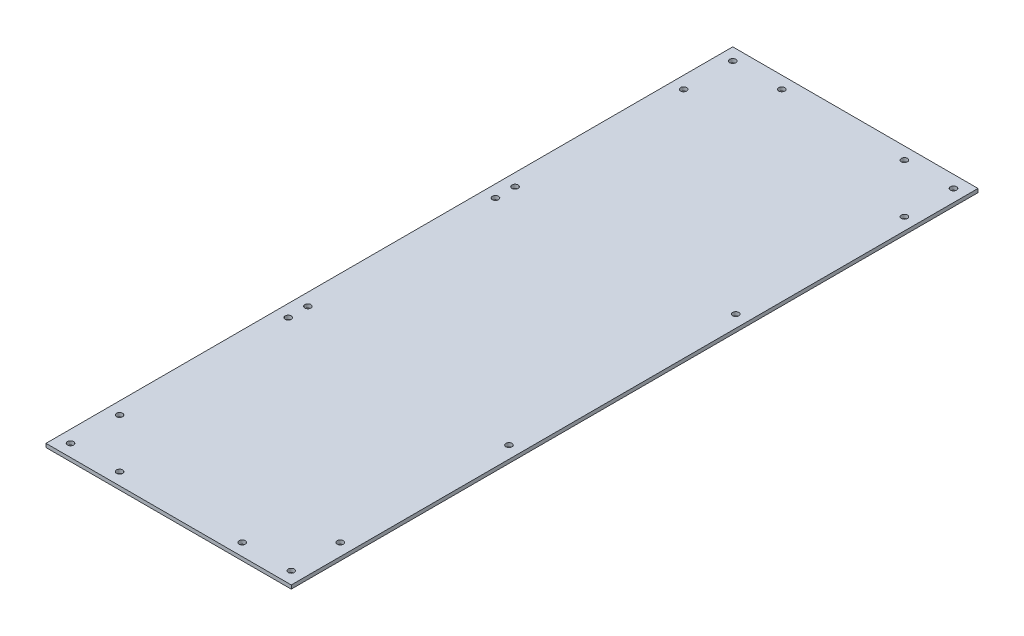
ISO-10303-21;
HEADER;
FILE_DESCRIPTION(('STEP AP214'),'2;1');
FILE_NAME('part.step','',(''),(''),'','','');
FILE_SCHEMA(('AUTOMOTIVE_DESIGN { 1 0 10303 214 1 1 1 1 }'));
ENDSEC;
DATA;
#1=APPLICATION_CONTEXT('core data for automotive mechanical design processes');
#2=APPLICATION_PROTOCOL_DEFINITION('international standard','automotive_design',2000,#1);
#3=PRODUCT_CONTEXT('',#1,'mechanical');
#4=PRODUCT('Part','Part','',(#3));
#5=PRODUCT_RELATED_PRODUCT_CATEGORY('part','',(#4));
#6=PRODUCT_DEFINITION_FORMATION('','',#4);
#7=PRODUCT_DEFINITION_CONTEXT('part definition',#1,'design');
#8=PRODUCT_DEFINITION('design','',#6,#7);
#9=PRODUCT_DEFINITION_SHAPE('','',#8);
#10=(LENGTH_UNIT() NAMED_UNIT(*) SI_UNIT(.MILLI.,.METRE.));
#11=(NAMED_UNIT(*) PLANE_ANGLE_UNIT() SI_UNIT($,.RADIAN.));
#12=(NAMED_UNIT(*) SI_UNIT($,.STERADIAN.) SOLID_ANGLE_UNIT());
#13=UNCERTAINTY_MEASURE_WITH_UNIT(LENGTH_MEASURE(1.E-05),#10,'distance_accuracy_value','');
#14=(GEOMETRIC_REPRESENTATION_CONTEXT(3) GLOBAL_UNCERTAINTY_ASSIGNED_CONTEXT((#13)) GLOBAL_UNIT_ASSIGNED_CONTEXT((#10,
#11,#12)) REPRESENTATION_CONTEXT('',''));
#15=CARTESIAN_POINT('',(0.,0.,0.));
#16=DIRECTION('',(0.,0.,1.));
#17=DIRECTION('',(1.,0.,0.));
#18=AXIS2_PLACEMENT_3D('',#15,#16,#17);
#19=CARTESIAN_POINT('',(0.,-3.,0.));
#20=DIRECTION('',(0.,-1.,0.));
#21=DIRECTION('',(1.,0.,0.));
#22=AXIS2_PLACEMENT_3D('',#19,#20,#21);
#23=PLANE('',#22);
#24=CARTESIAN_POINT('',(115.641025641026,-3.,-465.897435897436));
#25=DIRECTION('',(0.,1.,0.));
#26=DIRECTION('',(0.,0.,-1.));
#27=AXIS2_PLACEMENT_3D('',#24,#25,#26);
#28=CIRCLE('',#27,2.5);
#29=CARTESIAN_POINT('',(115.641025641026,-3.,-468.397435897436));
#30=VERTEX_POINT('',#29);
#31=EDGE_CURVE('E11',#30,#30,#28,.T.);
#32=ORIENTED_EDGE('',*,*,#31,.T.);
#33=EDGE_LOOP('',(#32));
#34=FACE_BOUND('',#33,.T.);
#35=CARTESIAN_POINT('',(-24.3589743589745,-3.,34.102564102564));
#36=DIRECTION('',(0.,1.,0.));
#37=DIRECTION('',(0.,0.,-1.));
#38=AXIS2_PLACEMENT_3D('',#35,#36,#37);
#39=CIRCLE('',#38,2.5);
#40=CARTESIAN_POINT('',(-24.3589743589745,-3.,31.602564102564));
#41=VERTEX_POINT('',#40);
#42=EDGE_CURVE('E24',#41,#41,#39,.T.);
#43=ORIENTED_EDGE('',*,*,#42,.T.);
#44=EDGE_LOOP('',(#43));
#45=FACE_BOUND('',#44,.T.);
#46=CARTESIAN_POINT('',(115.641025641026,-3.,74.102564102564));
#47=DIRECTION('',(0.,-1.,0.));
#48=DIRECTION('',(0.,0.,-1.));
#49=AXIS2_PLACEMENT_3D('',#46,#47,#48);
#50=CIRCLE('',#49,2.5);
#51=CARTESIAN_POINT('',(115.641025641026,-3.,71.602564102564));
#52=VERTEX_POINT('',#51);
#53=EDGE_CURVE('E188',#52,#52,#50,.T.);
#54=ORIENTED_EDGE('',*,*,#53,.F.);
#55=EDGE_LOOP('',(#54));
#56=FACE_BOUND('',#55,.T.);
#57=CARTESIAN_POINT('',(155.641025641026,-3.,34.102564102564));
#58=DIRECTION('',(0.,-1.,0.));
#59=DIRECTION('',(0.,0.,-1.));
#60=AXIS2_PLACEMENT_3D('',#57,#58,#59);
#61=CIRCLE('',#60,2.5);
#62=CARTESIAN_POINT('',(155.641025641026,-3.,31.602564102564));
#63=VERTEX_POINT('',#62);
#64=EDGE_CURVE('E185',#63,#63,#61,.T.);
#65=ORIENTED_EDGE('',*,*,#64,.F.);
#66=EDGE_LOOP('',(#65));
#67=FACE_BOUND('',#66,.T.);
#68=CARTESIAN_POINT('',(15.6410256410257,-3.,-465.897435897436));
#69=DIRECTION('',(0.,-1.,0.));
#70=DIRECTION('',(0.,0.,-1.));
#71=AXIS2_PLACEMENT_3D('',#68,#69,#70);
#72=CIRCLE('',#71,2.5);
#73=CARTESIAN_POINT('',(15.6410256410257,-3.,-468.397435897436));
#74=VERTEX_POINT('',#73);
#75=EDGE_CURVE('E182',#74,#74,#72,.T.);
#76=ORIENTED_EDGE('',*,*,#75,.F.);
#77=EDGE_LOOP('',(#76));
#78=FACE_BOUND('',#77,.T.);
#79=CARTESIAN_POINT('',(155.641025641026,-3.,-288.397435897436));
#80=DIRECTION('',(0.,-1.,0.));
#81=DIRECTION('',(1.,0.,0.));
#82=AXIS2_PLACEMENT_3D('',#79,#80,#81);
#83=CIRCLE('',#82,2.5);
#84=CARTESIAN_POINT('',(158.141025641026,-3.,-288.397435897436));
#85=VERTEX_POINT('',#84);
#86=EDGE_CURVE('E179',#85,#85,#83,.T.);
#87=ORIENTED_EDGE('',*,*,#86,.F.);
#88=EDGE_LOOP('',(#87));
#89=FACE_BOUND('',#88,.T.);
#90=CARTESIAN_POINT('',(-24.3589743589744,-3.,-119.397435897436));
#91=DIRECTION('',(0.,-1.,0.));
#92=DIRECTION('',(1.,0.,0.));
#93=AXIS2_PLACEMENT_3D('',#90,#91,#92);
#94=CIRCLE('',#93,2.5);
#95=CARTESIAN_POINT('',(-21.8589743589744,-3.,-119.397435897436));
#96=VERTEX_POINT('',#95);
#97=EDGE_CURVE('E176',#96,#96,#94,.T.);
#98=ORIENTED_EDGE('',*,*,#97,.F.);
#99=EDGE_LOOP('',(#98));
#100=FACE_BOUND('',#99,.T.);
#101=CARTESIAN_POINT('',(155.641025641026,-3.,-103.397435897436));
#102=DIRECTION('',(0.,-1.,0.));
#103=DIRECTION('',(1.,0.,0.));
#104=AXIS2_PLACEMENT_3D('',#101,#102,#103);
#105=CIRCLE('',#104,2.5);
#106=CARTESIAN_POINT('',(158.141025641026,-3.,-103.397435897436));
#107=VERTEX_POINT('',#106);
#108=EDGE_CURVE('E173',#107,#107,#105,.T.);
#109=ORIENTED_EDGE('',*,*,#108,.F.);
#110=EDGE_LOOP('',(#109));
#111=FACE_BOUND('',#110,.T.);
#112=CARTESIAN_POINT('',(-24.3589743589744,-3.,-103.397435897436));
#113=DIRECTION('',(0.,-1.,0.));
#114=DIRECTION('',(1.,0.,0.));
#115=AXIS2_PLACEMENT_3D('',#112,#113,#114);
#116=CIRCLE('',#115,2.5);
#117=CARTESIAN_POINT('',(-21.8589743589744,-3.,-103.397435897436));
#118=VERTEX_POINT('',#117);
#119=EDGE_CURVE('E170',#118,#118,#116,.T.);
#120=ORIENTED_EDGE('',*,*,#119,.F.);
#121=EDGE_LOOP('',(#120));
#122=FACE_BOUND('',#121,.T.);
#123=CARTESIAN_POINT('',(155.641025641026,-3.,74.102564102564));
#124=DIRECTION('',(0.,-1.,0.));
#125=DIRECTION('',(1.,0.,0.));
#126=AXIS2_PLACEMENT_3D('',#123,#124,#125);
#127=CIRCLE('',#126,2.5);
#128=CARTESIAN_POINT('',(158.141025641026,-3.,74.102564102564));
#129=VERTEX_POINT('',#128);
#130=EDGE_CURVE('E167',#129,#129,#127,.T.);
#131=ORIENTED_EDGE('',*,*,#130,.F.);
#132=EDGE_LOOP('',(#131));
#133=FACE_BOUND('',#132,.T.);
#134=CARTESIAN_POINT('',(-24.3589743589744,-3.,-465.897435897436));
#135=DIRECTION('',(0.,-1.,0.));
#136=DIRECTION('',(1.,0.,0.));
#137=AXIS2_PLACEMENT_3D('',#134,#135,#136);
#138=CIRCLE('',#137,2.5);
#139=CARTESIAN_POINT('',(-21.8589743589744,-3.,-465.897435897436));
#140=VERTEX_POINT('',#139);
#141=EDGE_CURVE('E164',#140,#140,#138,.T.);
#142=ORIENTED_EDGE('',*,*,#141,.F.);
#143=EDGE_LOOP('',(#142));
#144=FACE_BOUND('',#143,.T.);
#145=CARTESIAN_POINT('',(155.641025641026,-3.,-465.897435897436));
#146=DIRECTION('',(0.,-1.,0.));
#147=DIRECTION('',(1.,0.,0.));
#148=AXIS2_PLACEMENT_3D('',#145,#146,#147);
#149=CIRCLE('',#148,2.5);
#150=CARTESIAN_POINT('',(158.141025641026,-3.,-465.897435897436));
#151=VERTEX_POINT('',#150);
#152=EDGE_CURVE('E161',#151,#151,#149,.T.);
#153=ORIENTED_EDGE('',*,*,#152,.F.);
#154=EDGE_LOOP('',(#153));
#155=FACE_BOUND('',#154,.T.);
#156=CARTESIAN_POINT('',(-24.3589743589744,-3.,-288.397435897436));
#157=DIRECTION('',(0.,-1.,0.));
#158=DIRECTION('',(1.,0.,0.));
#159=AXIS2_PLACEMENT_3D('',#156,#157,#158);
#160=CIRCLE('',#159,2.5);
#161=CARTESIAN_POINT('',(-21.8589743589744,-3.,-288.397435897436));
#162=VERTEX_POINT('',#161);
#163=EDGE_CURVE('E158',#162,#162,#160,.T.);
#164=ORIENTED_EDGE('',*,*,#163,.F.);
#165=EDGE_LOOP('',(#164));
#166=FACE_BOUND('',#165,.T.);
#167=CARTESIAN_POINT('',(-24.3589743589744,-3.,-272.397435897436));
#168=DIRECTION('',(0.,-1.,0.));
#169=DIRECTION('',(1.,0.,0.));
#170=AXIS2_PLACEMENT_3D('',#167,#168,#169);
#171=CIRCLE('',#170,2.5);
#172=CARTESIAN_POINT('',(-21.8589743589744,-3.,-272.397435897436));
#173=VERTEX_POINT('',#172);
#174=EDGE_CURVE('E155',#173,#173,#171,.T.);
#175=ORIENTED_EDGE('',*,*,#174,.F.);
#176=EDGE_LOOP('',(#175));
#177=FACE_BOUND('',#176,.T.);
#178=CARTESIAN_POINT('',(-24.3589743589744,-3.,74.102564102564));
#179=DIRECTION('',(0.,-1.,0.));
#180=DIRECTION('',(1.,0.,0.));
#181=AXIS2_PLACEMENT_3D('',#178,#179,#180);
#182=CIRCLE('',#181,2.5);
#183=CARTESIAN_POINT('',(-21.8589743589744,-3.,74.102564102564));
#184=VERTEX_POINT('',#183);
#185=EDGE_CURVE('E152',#184,#184,#182,.T.);
#186=ORIENTED_EDGE('',*,*,#185,.F.);
#187=EDGE_LOOP('',(#186));
#188=FACE_BOUND('',#187,.T.);
#189=DIRECTION('',(0.,0.,-1.));
#190=VECTOR('',#189,1.);
#191=CARTESIAN_POINT('',(-34.3589743589744,-3.,84.102564102564));
#192=LINE('',#191,#190);
#193=CARTESIAN_POINT('',(-34.3589743589744,-3.,84.102564102564));
#194=VERTEX_POINT('',#193);
#195=CARTESIAN_POINT('',(-34.3589743589743,-3.,-475.897435897436));
#196=VERTEX_POINT('',#195);
#197=EDGE_CURVE('E31',#194,#196,#192,.T.);
#198=ORIENTED_EDGE('',*,*,#197,.T.);
#199=DIRECTION('',(1.,0.,0.));
#200=VECTOR('',#199,1.);
#201=CARTESIAN_POINT('',(-34.3589743589743,-3.,-475.897435897436));
#202=LINE('',#201,#200);
#203=CARTESIAN_POINT('',(165.641025641026,-3.,-475.897435897436));
#204=VERTEX_POINT('',#203);
#205=EDGE_CURVE('E36',#196,#204,#202,.T.);
#206=ORIENTED_EDGE('',*,*,#205,.T.);
#207=DIRECTION('',(0.,0.,1.));
#208=VECTOR('',#207,1.);
#209=CARTESIAN_POINT('',(165.641025641026,-3.,84.102564102564));
#210=LINE('',#209,#208);
#211=CARTESIAN_POINT('',(165.641025641026,-3.,84.102564102564));
#212=VERTEX_POINT('',#211);
#213=EDGE_CURVE('E148',#204,#212,#210,.T.);
#214=ORIENTED_EDGE('',*,*,#213,.T.);
#215=DIRECTION('',(-1.,0.,0.));
#216=VECTOR('',#215,1.);
#217=CARTESIAN_POINT('',(-34.3589743589744,-3.,84.102564102564));
#218=LINE('',#217,#216);
#219=EDGE_CURVE('E146',#212,#194,#218,.T.);
#220=ORIENTED_EDGE('',*,*,#219,.T.);
#221=EDGE_LOOP('',(#198,#206,#214,#220));
#222=FACE_BOUND('',#221,.T.);
#223=CARTESIAN_POINT('',(-24.3589743589744,-3.,-425.897435897436));
#224=DIRECTION('',(0.,-1.,0.));
#225=DIRECTION('',(0.,0.,-1.));
#226=AXIS2_PLACEMENT_3D('',#223,#224,#225);
#227=CIRCLE('',#226,2.5);
#228=CARTESIAN_POINT('',(-24.3589743589744,-3.,-428.397435897436));
#229=VERTEX_POINT('',#228);
#230=EDGE_CURVE('E143',#229,#229,#227,.T.);
#231=ORIENTED_EDGE('',*,*,#230,.F.);
#232=EDGE_LOOP('',(#231));
#233=FACE_BOUND('',#232,.T.);
#234=CARTESIAN_POINT('',(155.641025641026,-3.,-425.897435897436));
#235=DIRECTION('',(0.,1.,0.));
#236=DIRECTION('',(0.,0.,-1.));
#237=AXIS2_PLACEMENT_3D('',#234,#235,#236);
#238=CIRCLE('',#237,2.5);
#239=CARTESIAN_POINT('',(155.641025641026,-3.,-428.397435897436));
#240=VERTEX_POINT('',#239);
#241=EDGE_CURVE('E140',#240,#240,#238,.T.);
#242=ORIENTED_EDGE('',*,*,#241,.T.);
#243=EDGE_LOOP('',(#242));
#244=FACE_BOUND('',#243,.T.);
#245=CARTESIAN_POINT('',(15.6410256410256,-3.,74.102564102564));
#246=DIRECTION('',(0.,1.,0.));
#247=DIRECTION('',(0.,0.,-1.));
#248=AXIS2_PLACEMENT_3D('',#245,#246,#247);
#249=CIRCLE('',#248,2.5);
#250=CARTESIAN_POINT('',(15.6410256410256,-3.,71.602564102564));
#251=VERTEX_POINT('',#250);
#252=EDGE_CURVE('E137',#251,#251,#249,.T.);
#253=ORIENTED_EDGE('',*,*,#252,.T.);
#254=EDGE_LOOP('',(#253));
#255=FACE_BOUND('',#254,.T.);
#256=ADVANCED_FACE('F17',(#34,#45,#56,#67,#78,#89,#100,#111,#122,#133,#144,#155,#166,#177,#188,
#222,#233,#244,#255),#23,.T.);
#257=CARTESIAN_POINT('',(0.,0.,0.));
#258=DIRECTION('',(0.,-1.,0.));
#259=DIRECTION('',(1.,0.,0.));
#260=AXIS2_PLACEMENT_3D('',#257,#258,#259);
#261=PLANE('',#260);
#262=CARTESIAN_POINT('',(-24.3589743589744,0.,-425.897435897436));
#263=DIRECTION('',(0.,-1.,0.));
#264=DIRECTION('',(0.,0.,-1.));
#265=AXIS2_PLACEMENT_3D('',#262,#263,#264);
#266=CIRCLE('',#265,2.5);
#267=CARTESIAN_POINT('',(-24.3589743589744,0.,-428.397435897436));
#268=VERTEX_POINT('',#267);
#269=EDGE_CURVE('E134',#268,#268,#266,.T.);
#270=ORIENTED_EDGE('',*,*,#269,.T.);
#271=EDGE_LOOP('',(#270));
#272=FACE_BOUND('',#271,.T.);
#273=CARTESIAN_POINT('',(115.641025641026,0.,74.102564102564));
#274=DIRECTION('',(0.,-1.,0.));
#275=DIRECTION('',(0.,0.,-1.));
#276=AXIS2_PLACEMENT_3D('',#273,#274,#275);
#277=CIRCLE('',#276,2.5);
#278=CARTESIAN_POINT('',(115.641025641026,0.,71.602564102564));
#279=VERTEX_POINT('',#278);
#280=EDGE_CURVE('E131',#279,#279,#277,.T.);
#281=ORIENTED_EDGE('',*,*,#280,.T.);
#282=EDGE_LOOP('',(#281));
#283=FACE_BOUND('',#282,.T.);
#284=CARTESIAN_POINT('',(155.641025641026,0.,34.102564102564));
#285=DIRECTION('',(0.,-1.,0.));
#286=DIRECTION('',(0.,0.,-1.));
#287=AXIS2_PLACEMENT_3D('',#284,#285,#286);
#288=CIRCLE('',#287,2.5);
#289=CARTESIAN_POINT('',(155.641025641026,0.,31.602564102564));
#290=VERTEX_POINT('',#289);
#291=EDGE_CURVE('E128',#290,#290,#288,.T.);
#292=ORIENTED_EDGE('',*,*,#291,.T.);
#293=EDGE_LOOP('',(#292));
#294=FACE_BOUND('',#293,.T.);
#295=CARTESIAN_POINT('',(15.6410256410257,0.,-465.897435897436));
#296=DIRECTION('',(0.,-1.,0.));
#297=DIRECTION('',(0.,0.,-1.));
#298=AXIS2_PLACEMENT_3D('',#295,#296,#297);
#299=CIRCLE('',#298,2.5);
#300=CARTESIAN_POINT('',(15.6410256410257,0.,-468.397435897436));
#301=VERTEX_POINT('',#300);
#302=EDGE_CURVE('E125',#301,#301,#299,.T.);
#303=ORIENTED_EDGE('',*,*,#302,.T.);
#304=EDGE_LOOP('',(#303));
#305=FACE_BOUND('',#304,.T.);
#306=CARTESIAN_POINT('',(155.641025641026,0.,-288.397435897436));
#307=DIRECTION('',(0.,-1.,0.));
#308=DIRECTION('',(1.,0.,0.));
#309=AXIS2_PLACEMENT_3D('',#306,#307,#308);
#310=CIRCLE('',#309,2.5);
#311=CARTESIAN_POINT('',(158.141025641026,0.,-288.397435897436));
#312=VERTEX_POINT('',#311);
#313=EDGE_CURVE('E122',#312,#312,#310,.T.);
#314=ORIENTED_EDGE('',*,*,#313,.T.);
#315=EDGE_LOOP('',(#314));
#316=FACE_BOUND('',#315,.T.);
#317=CARTESIAN_POINT('',(-24.3589743589744,0.,-119.397435897436));
#318=DIRECTION('',(0.,-1.,0.));
#319=DIRECTION('',(1.,0.,0.));
#320=AXIS2_PLACEMENT_3D('',#317,#318,#319);
#321=CIRCLE('',#320,2.5);
#322=CARTESIAN_POINT('',(-21.8589743589744,0.,-119.397435897436));
#323=VERTEX_POINT('',#322);
#324=EDGE_CURVE('E119',#323,#323,#321,.T.);
#325=ORIENTED_EDGE('',*,*,#324,.T.);
#326=EDGE_LOOP('',(#325));
#327=FACE_BOUND('',#326,.T.);
#328=CARTESIAN_POINT('',(155.641025641026,0.,-103.397435897436));
#329=DIRECTION('',(0.,-1.,0.));
#330=DIRECTION('',(1.,0.,0.));
#331=AXIS2_PLACEMENT_3D('',#328,#329,#330);
#332=CIRCLE('',#331,2.5);
#333=CARTESIAN_POINT('',(158.141025641026,0.,-103.397435897436));
#334=VERTEX_POINT('',#333);
#335=EDGE_CURVE('E116',#334,#334,#332,.T.);
#336=ORIENTED_EDGE('',*,*,#335,.T.);
#337=EDGE_LOOP('',(#336));
#338=FACE_BOUND('',#337,.T.);
#339=CARTESIAN_POINT('',(-24.3589743589744,0.,-103.397435897436));
#340=DIRECTION('',(0.,-1.,0.));
#341=DIRECTION('',(1.,0.,0.));
#342=AXIS2_PLACEMENT_3D('',#339,#340,#341);
#343=CIRCLE('',#342,2.5);
#344=CARTESIAN_POINT('',(-21.8589743589744,0.,-103.397435897436));
#345=VERTEX_POINT('',#344);
#346=EDGE_CURVE('E113',#345,#345,#343,.T.);
#347=ORIENTED_EDGE('',*,*,#346,.T.);
#348=EDGE_LOOP('',(#347));
#349=FACE_BOUND('',#348,.T.);
#350=CARTESIAN_POINT('',(155.641025641026,0.,74.102564102564));
#351=DIRECTION('',(0.,-1.,0.));
#352=DIRECTION('',(1.,0.,0.));
#353=AXIS2_PLACEMENT_3D('',#350,#351,#352);
#354=CIRCLE('',#353,2.5);
#355=CARTESIAN_POINT('',(158.141025641026,0.,74.102564102564));
#356=VERTEX_POINT('',#355);
#357=EDGE_CURVE('E110',#356,#356,#354,.T.);
#358=ORIENTED_EDGE('',*,*,#357,.T.);
#359=EDGE_LOOP('',(#358));
#360=FACE_BOUND('',#359,.T.);
#361=CARTESIAN_POINT('',(-24.3589743589744,0.,-465.897435897436));
#362=DIRECTION('',(0.,-1.,0.));
#363=DIRECTION('',(1.,0.,0.));
#364=AXIS2_PLACEMENT_3D('',#361,#362,#363);
#365=CIRCLE('',#364,2.5);
#366=CARTESIAN_POINT('',(-21.8589743589744,0.,-465.897435897436));
#367=VERTEX_POINT('',#366);
#368=EDGE_CURVE('E107',#367,#367,#365,.T.);
#369=ORIENTED_EDGE('',*,*,#368,.T.);
#370=EDGE_LOOP('',(#369));
#371=FACE_BOUND('',#370,.T.);
#372=CARTESIAN_POINT('',(155.641025641026,0.,-465.897435897436));
#373=DIRECTION('',(0.,-1.,0.));
#374=DIRECTION('',(1.,0.,0.));
#375=AXIS2_PLACEMENT_3D('',#372,#373,#374);
#376=CIRCLE('',#375,2.5);
#377=CARTESIAN_POINT('',(158.141025641026,0.,-465.897435897436));
#378=VERTEX_POINT('',#377);
#379=EDGE_CURVE('E104',#378,#378,#376,.T.);
#380=ORIENTED_EDGE('',*,*,#379,.T.);
#381=EDGE_LOOP('',(#380));
#382=FACE_BOUND('',#381,.T.);
#383=CARTESIAN_POINT('',(-24.3589743589744,0.,-288.397435897436));
#384=DIRECTION('',(0.,-1.,0.));
#385=DIRECTION('',(1.,0.,0.));
#386=AXIS2_PLACEMENT_3D('',#383,#384,#385);
#387=CIRCLE('',#386,2.5);
#388=CARTESIAN_POINT('',(-21.8589743589744,0.,-288.397435897436));
#389=VERTEX_POINT('',#388);
#390=EDGE_CURVE('E101',#389,#389,#387,.T.);
#391=ORIENTED_EDGE('',*,*,#390,.T.);
#392=EDGE_LOOP('',(#391));
#393=FACE_BOUND('',#392,.T.);
#394=CARTESIAN_POINT('',(-24.3589743589744,0.,-272.397435897436));
#395=DIRECTION('',(0.,-1.,0.));
#396=DIRECTION('',(1.,0.,0.));
#397=AXIS2_PLACEMENT_3D('',#394,#395,#396);
#398=CIRCLE('',#397,2.5);
#399=CARTESIAN_POINT('',(-21.8589743589744,0.,-272.397435897436));
#400=VERTEX_POINT('',#399);
#401=EDGE_CURVE('E98',#400,#400,#398,.T.);
#402=ORIENTED_EDGE('',*,*,#401,.T.);
#403=EDGE_LOOP('',(#402));
#404=FACE_BOUND('',#403,.T.);
#405=CARTESIAN_POINT('',(-24.3589743589744,0.,74.102564102564));
#406=DIRECTION('',(0.,-1.,0.));
#407=DIRECTION('',(1.,0.,0.));
#408=AXIS2_PLACEMENT_3D('',#405,#406,#407);
#409=CIRCLE('',#408,2.5);
#410=CARTESIAN_POINT('',(-21.8589743589744,0.,74.102564102564));
#411=VERTEX_POINT('',#410);
#412=EDGE_CURVE('E74',#411,#411,#409,.T.);
#413=ORIENTED_EDGE('',*,*,#412,.T.);
#414=EDGE_LOOP('',(#413));
#415=FACE_BOUND('',#414,.T.);
#416=DIRECTION('',(0.,0.,-1.));
#417=VECTOR('',#416,1.);
#418=CARTESIAN_POINT('',(-34.3589743589744,0.,84.102564102564));
#419=LINE('',#418,#417);
#420=CARTESIAN_POINT('',(-34.3589743589744,0.,84.102564102564));
#421=VERTEX_POINT('',#420);
#422=CARTESIAN_POINT('',(-34.3589743589743,0.,-475.897435897436));
#423=VERTEX_POINT('',#422);
#424=EDGE_CURVE('E59',#421,#423,#419,.T.);
#425=ORIENTED_EDGE('',*,*,#424,.F.);
#426=DIRECTION('',(-1.,0.,0.));
#427=VECTOR('',#426,1.);
#428=CARTESIAN_POINT('',(-34.3589743589744,0.,84.102564102564));
#429=LINE('',#428,#427);
#430=CARTESIAN_POINT('',(165.641025641026,0.,84.102564102564));
#431=VERTEX_POINT('',#430);
#432=EDGE_CURVE('E75',#431,#421,#429,.T.);
#433=ORIENTED_EDGE('',*,*,#432,.F.);
#434=DIRECTION('',(0.,0.,1.));
#435=VECTOR('',#434,1.);
#436=CARTESIAN_POINT('',(165.641025641026,0.,84.102564102564));
#437=LINE('',#436,#435);
#438=CARTESIAN_POINT('',(165.641025641026,0.,-475.897435897436));
#439=VERTEX_POINT('',#438);
#440=EDGE_CURVE('E62',#439,#431,#437,.T.);
#441=ORIENTED_EDGE('',*,*,#440,.F.);
#442=DIRECTION('',(1.,0.,0.));
#443=VECTOR('',#442,1.);
#444=CARTESIAN_POINT('',(-34.3589743589743,0.,-475.897435897436));
#445=LINE('',#444,#443);
#446=EDGE_CURVE('E55',#423,#439,#445,.T.);
#447=ORIENTED_EDGE('',*,*,#446,.F.);
#448=EDGE_LOOP('',(#425,#433,#441,#447));
#449=FACE_BOUND('',#448,.T.);
#450=CARTESIAN_POINT('',(-24.3589743589745,0.,34.102564102564));
#451=DIRECTION('',(0.,-1.,0.));
#452=DIRECTION('',(0.,0.,-1.));
#453=AXIS2_PLACEMENT_3D('',#450,#451,#452);
#454=CIRCLE('',#453,2.5);
#455=CARTESIAN_POINT('',(-24.3589743589745,0.,31.602564102564));
#456=VERTEX_POINT('',#455);
#457=EDGE_CURVE('E66',#456,#456,#454,.F.);
#458=ORIENTED_EDGE('',*,*,#457,.F.);
#459=EDGE_LOOP('',(#458));
#460=FACE_BOUND('',#459,.T.);
#461=CARTESIAN_POINT('',(155.641025641026,0.,-425.897435897436));
#462=DIRECTION('',(0.,-1.,0.));
#463=DIRECTION('',(0.,0.,-1.));
#464=AXIS2_PLACEMENT_3D('',#461,#462,#463);
#465=CIRCLE('',#464,2.5);
#466=CARTESIAN_POINT('',(155.641025641026,0.,-428.397435897436));
#467=VERTEX_POINT('',#466);
#468=EDGE_CURVE('E89',#467,#467,#465,.F.);
#469=ORIENTED_EDGE('',*,*,#468,.F.);
#470=EDGE_LOOP('',(#469));
#471=FACE_BOUND('',#470,.T.);
#472=CARTESIAN_POINT('',(115.641025641026,0.,-465.897435897436));
#473=DIRECTION('',(0.,-1.,0.));
#474=DIRECTION('',(0.,0.,-1.));
#475=AXIS2_PLACEMENT_3D('',#472,#473,#474);
#476=CIRCLE('',#475,2.5);
#477=CARTESIAN_POINT('',(115.641025641026,0.,-468.397435897436));
#478=VERTEX_POINT('',#477);
#479=EDGE_CURVE('E81',#478,#478,#476,.F.);
#480=ORIENTED_EDGE('',*,*,#479,.F.);
#481=EDGE_LOOP('',(#480));
#482=FACE_BOUND('',#481,.T.);
#483=CARTESIAN_POINT('',(15.6410256410256,0.,74.102564102564));
#484=DIRECTION('',(0.,-1.,0.));
#485=DIRECTION('',(0.,0.,-1.));
#486=AXIS2_PLACEMENT_3D('',#483,#484,#485);
#487=CIRCLE('',#486,2.5);
#488=CARTESIAN_POINT('',(15.6410256410256,0.,71.602564102564));
#489=VERTEX_POINT('',#488);
#490=EDGE_CURVE('E78',#489,#489,#487,.F.);
#491=ORIENTED_EDGE('',*,*,#490,.F.);
#492=EDGE_LOOP('',(#491));
#493=FACE_BOUND('',#492,.T.);
#494=ADVANCED_FACE('F57',(#272,#283,#294,#305,#316,#327,#338,#349,#360,#371,#382,#393,#404,#415,
#449,#460,#471,#482,#493),#261,.F.);
#495=CARTESIAN_POINT('',(-34.3589743589744,-3.,84.102564102564));
#496=DIRECTION('',(1.,0.,0.));
#497=DIRECTION('',(0.,0.,1.));
#498=AXIS2_PLACEMENT_3D('',#495,#496,#497);
#499=PLANE('',#498);
#500=ORIENTED_EDGE('',*,*,#424,.T.);
#501=DIRECTION('',(0.,1.,0.));
#502=VECTOR('',#501,1.);
#503=CARTESIAN_POINT('',(-34.3589743589743,-3.,-475.897435897436));
#504=LINE('',#503,#502);
#505=EDGE_CURVE('E70',#196,#423,#504,.T.);
#506=ORIENTED_EDGE('',*,*,#505,.F.);
#507=ORIENTED_EDGE('',*,*,#197,.F.);
#508=DIRECTION('',(0.,1.,0.));
#509=VECTOR('',#508,1.);
#510=CARTESIAN_POINT('',(-34.3589743589744,-3.,84.102564102564));
#511=LINE('',#510,#509);
#512=EDGE_CURVE('E72',#194,#421,#511,.T.);
#513=ORIENTED_EDGE('',*,*,#512,.T.);
#514=EDGE_LOOP('',(#500,#506,#507,#513));
#515=FACE_BOUND('',#514,.T.);
#516=ADVANCED_FACE('F69',(#515),#499,.F.);
#517=CARTESIAN_POINT('',(-34.3589743589743,-3.,-475.897435897436));
#518=DIRECTION('',(0.,0.,1.));
#519=DIRECTION('',(0.,-1.,0.));
#520=AXIS2_PLACEMENT_3D('',#517,#518,#519);
#521=PLANE('',#520);
#522=ORIENTED_EDGE('',*,*,#446,.T.);
#523=DIRECTION('',(0.,1.,0.));
#524=VECTOR('',#523,1.);
#525=CARTESIAN_POINT('',(165.641025641026,-3.,-475.897435897436));
#526=LINE('',#525,#524);
#527=EDGE_CURVE('E83',#204,#439,#526,.T.);
#528=ORIENTED_EDGE('',*,*,#527,.F.);
#529=ORIENTED_EDGE('',*,*,#205,.F.);
#530=ORIENTED_EDGE('',*,*,#505,.T.);
#531=EDGE_LOOP('',(#522,#528,#529,#530));
#532=FACE_BOUND('',#531,.T.);
#533=ADVANCED_FACE('F77',(#532),#521,.F.);
#534=CARTESIAN_POINT('',(165.641025641026,-3.,84.102564102564));
#535=DIRECTION('',(-1.,0.,0.));
#536=DIRECTION('',(0.,0.,-1.));
#537=AXIS2_PLACEMENT_3D('',#534,#535,#536);
#538=PLANE('',#537);
#539=ORIENTED_EDGE('',*,*,#440,.T.);
#540=DIRECTION('',(0.,1.,0.));
#541=VECTOR('',#540,1.);
#542=CARTESIAN_POINT('',(165.641025641026,-3.,84.102564102564));
#543=LINE('',#542,#541);
#544=EDGE_CURVE('E525',#212,#431,#543,.T.);
#545=ORIENTED_EDGE('',*,*,#544,.F.);
#546=ORIENTED_EDGE('',*,*,#213,.F.);
#547=ORIENTED_EDGE('',*,*,#527,.T.);
#548=EDGE_LOOP('',(#539,#545,#546,#547));
#549=FACE_BOUND('',#548,.T.);
#550=ADVANCED_FACE('F256',(#549),#538,.F.);
#551=CARTESIAN_POINT('',(-34.3589743589744,-3.,84.102564102564));
#552=DIRECTION('',(0.,0.,-1.));
#553=DIRECTION('',(0.,1.,0.));
#554=AXIS2_PLACEMENT_3D('',#551,#552,#553);
#555=PLANE('',#554);
#556=ORIENTED_EDGE('',*,*,#432,.T.);
#557=ORIENTED_EDGE('',*,*,#512,.F.);
#558=ORIENTED_EDGE('',*,*,#219,.F.);
#559=ORIENTED_EDGE('',*,*,#544,.T.);
#560=EDGE_LOOP('',(#556,#557,#558,#559));
#561=FACE_BOUND('',#560,.T.);
#562=ADVANCED_FACE('F264',(#561),#555,.F.);
#563=CARTESIAN_POINT('',(-24.3589743589744,0.,74.102564102564));
#564=DIRECTION('',(0.,-1.,0.));
#565=DIRECTION('',(1.,0.,0.));
#566=AXIS2_PLACEMENT_3D('',#563,#564,#565);
#567=CYLINDRICAL_SURFACE('',#566,2.5);
#568=ORIENTED_EDGE('',*,*,#412,.F.);
#569=EDGE_LOOP('',(#568));
#570=FACE_BOUND('',#569,.T.);
#571=ORIENTED_EDGE('',*,*,#185,.T.);
#572=EDGE_LOOP('',(#571));
#573=FACE_BOUND('',#572,.T.);
#574=ADVANCED_FACE('F273',(#570,#573),#567,.F.);
#575=CARTESIAN_POINT('',(-24.3589743589744,0.,-272.397435897436));
#576=DIRECTION('',(0.,-1.,0.));
#577=DIRECTION('',(1.,0.,0.));
#578=AXIS2_PLACEMENT_3D('',#575,#576,#577);
#579=CYLINDRICAL_SURFACE('',#578,2.5);
#580=ORIENTED_EDGE('',*,*,#401,.F.);
#581=EDGE_LOOP('',(#580));
#582=FACE_BOUND('',#581,.T.);
#583=ORIENTED_EDGE('',*,*,#174,.T.);
#584=EDGE_LOOP('',(#583));
#585=FACE_BOUND('',#584,.T.);
#586=ADVANCED_FACE('F282',(#582,#585),#579,.F.);
#587=CARTESIAN_POINT('',(-24.3589743589744,0.,-288.397435897436));
#588=DIRECTION('',(0.,-1.,0.));
#589=DIRECTION('',(1.,0.,0.));
#590=AXIS2_PLACEMENT_3D('',#587,#588,#589);
#591=CYLINDRICAL_SURFACE('',#590,2.5);
#592=ORIENTED_EDGE('',*,*,#390,.F.);
#593=EDGE_LOOP('',(#592));
#594=FACE_BOUND('',#593,.T.);
#595=ORIENTED_EDGE('',*,*,#163,.T.);
#596=EDGE_LOOP('',(#595));
#597=FACE_BOUND('',#596,.T.);
#598=ADVANCED_FACE('F291',(#594,#597),#591,.F.);
#599=CARTESIAN_POINT('',(155.641025641026,0.,-465.897435897436));
#600=DIRECTION('',(0.,-1.,0.));
#601=DIRECTION('',(1.,0.,0.));
#602=AXIS2_PLACEMENT_3D('',#599,#600,#601);
#603=CYLINDRICAL_SURFACE('',#602,2.5);
#604=ORIENTED_EDGE('',*,*,#379,.F.);
#605=EDGE_LOOP('',(#604));
#606=FACE_BOUND('',#605,.T.);
#607=ORIENTED_EDGE('',*,*,#152,.T.);
#608=EDGE_LOOP('',(#607));
#609=FACE_BOUND('',#608,.T.);
#610=ADVANCED_FACE('F300',(#606,#609),#603,.F.);
#611=CARTESIAN_POINT('',(-24.3589743589744,0.,-465.897435897436));
#612=DIRECTION('',(0.,-1.,0.));
#613=DIRECTION('',(1.,0.,0.));
#614=AXIS2_PLACEMENT_3D('',#611,#612,#613);
#615=CYLINDRICAL_SURFACE('',#614,2.5);
#616=ORIENTED_EDGE('',*,*,#368,.F.);
#617=EDGE_LOOP('',(#616));
#618=FACE_BOUND('',#617,.T.);
#619=ORIENTED_EDGE('',*,*,#141,.T.);
#620=EDGE_LOOP('',(#619));
#621=FACE_BOUND('',#620,.T.);
#622=ADVANCED_FACE('F309',(#618,#621),#615,.F.);
#623=CARTESIAN_POINT('',(155.641025641026,0.,74.102564102564));
#624=DIRECTION('',(0.,-1.,0.));
#625=DIRECTION('',(1.,0.,0.));
#626=AXIS2_PLACEMENT_3D('',#623,#624,#625);
#627=CYLINDRICAL_SURFACE('',#626,2.5);
#628=ORIENTED_EDGE('',*,*,#357,.F.);
#629=EDGE_LOOP('',(#628));
#630=FACE_BOUND('',#629,.T.);
#631=ORIENTED_EDGE('',*,*,#130,.T.);
#632=EDGE_LOOP('',(#631));
#633=FACE_BOUND('',#632,.T.);
#634=ADVANCED_FACE('F318',(#630,#633),#627,.F.);
#635=CARTESIAN_POINT('',(-24.3589743589744,0.,-103.397435897436));
#636=DIRECTION('',(0.,-1.,0.));
#637=DIRECTION('',(1.,0.,0.));
#638=AXIS2_PLACEMENT_3D('',#635,#636,#637);
#639=CYLINDRICAL_SURFACE('',#638,2.5);
#640=ORIENTED_EDGE('',*,*,#346,.F.);
#641=EDGE_LOOP('',(#640));
#642=FACE_BOUND('',#641,.T.);
#643=ORIENTED_EDGE('',*,*,#119,.T.);
#644=EDGE_LOOP('',(#643));
#645=FACE_BOUND('',#644,.T.);
#646=ADVANCED_FACE('F327',(#642,#645),#639,.F.);
#647=CARTESIAN_POINT('',(155.641025641026,0.,-103.397435897436));
#648=DIRECTION('',(0.,-1.,0.));
#649=DIRECTION('',(1.,0.,0.));
#650=AXIS2_PLACEMENT_3D('',#647,#648,#649);
#651=CYLINDRICAL_SURFACE('',#650,2.5);
#652=ORIENTED_EDGE('',*,*,#335,.F.);
#653=EDGE_LOOP('',(#652));
#654=FACE_BOUND('',#653,.T.);
#655=ORIENTED_EDGE('',*,*,#108,.T.);
#656=EDGE_LOOP('',(#655));
#657=FACE_BOUND('',#656,.T.);
#658=ADVANCED_FACE('F336',(#654,#657),#651,.F.);
#659=CARTESIAN_POINT('',(-24.3589743589744,0.,-119.397435897436));
#660=DIRECTION('',(0.,-1.,0.));
#661=DIRECTION('',(1.,0.,0.));
#662=AXIS2_PLACEMENT_3D('',#659,#660,#661);
#663=CYLINDRICAL_SURFACE('',#662,2.5);
#664=ORIENTED_EDGE('',*,*,#324,.F.);
#665=EDGE_LOOP('',(#664));
#666=FACE_BOUND('',#665,.T.);
#667=ORIENTED_EDGE('',*,*,#97,.T.);
#668=EDGE_LOOP('',(#667));
#669=FACE_BOUND('',#668,.T.);
#670=ADVANCED_FACE('F345',(#666,#669),#663,.F.);
#671=CARTESIAN_POINT('',(155.641025641026,0.,-288.397435897436));
#672=DIRECTION('',(0.,-1.,0.));
#673=DIRECTION('',(1.,0.,0.));
#674=AXIS2_PLACEMENT_3D('',#671,#672,#673);
#675=CYLINDRICAL_SURFACE('',#674,2.5);
#676=ORIENTED_EDGE('',*,*,#313,.F.);
#677=EDGE_LOOP('',(#676));
#678=FACE_BOUND('',#677,.T.);
#679=ORIENTED_EDGE('',*,*,#86,.T.);
#680=EDGE_LOOP('',(#679));
#681=FACE_BOUND('',#680,.T.);
#682=ADVANCED_FACE('F354',(#678,#681),#675,.F.);
#683=CARTESIAN_POINT('',(15.6410256410257,22.,-465.897435897436));
#684=DIRECTION('',(0.,-1.,0.));
#685=DIRECTION('',(0.,0.,-1.));
#686=AXIS2_PLACEMENT_3D('',#683,#684,#685);
#687=CYLINDRICAL_SURFACE('',#686,2.5);
#688=ORIENTED_EDGE('',*,*,#75,.T.);
#689=EDGE_LOOP('',(#688));
#690=FACE_BOUND('',#689,.T.);
#691=ORIENTED_EDGE('',*,*,#302,.F.);
#692=EDGE_LOOP('',(#691));
#693=FACE_BOUND('',#692,.T.);
#694=ADVANCED_FACE('F363',(#690,#693),#687,.F.);
#695=CARTESIAN_POINT('',(155.641025641026,22.,34.102564102564));
#696=DIRECTION('',(0.,-1.,0.));
#697=DIRECTION('',(0.,0.,-1.));
#698=AXIS2_PLACEMENT_3D('',#695,#696,#697);
#699=CYLINDRICAL_SURFACE('',#698,2.5);
#700=ORIENTED_EDGE('',*,*,#64,.T.);
#701=EDGE_LOOP('',(#700));
#702=FACE_BOUND('',#701,.T.);
#703=ORIENTED_EDGE('',*,*,#291,.F.);
#704=EDGE_LOOP('',(#703));
#705=FACE_BOUND('',#704,.T.);
#706=ADVANCED_FACE('F372',(#702,#705),#699,.F.);
#707=CARTESIAN_POINT('',(115.641025641026,22.,74.102564102564));
#708=DIRECTION('',(0.,-1.,0.));
#709=DIRECTION('',(0.,0.,-1.));
#710=AXIS2_PLACEMENT_3D('',#707,#708,#709);
#711=CYLINDRICAL_SURFACE('',#710,2.5);
#712=ORIENTED_EDGE('',*,*,#53,.T.);
#713=EDGE_LOOP('',(#712));
#714=FACE_BOUND('',#713,.T.);
#715=ORIENTED_EDGE('',*,*,#280,.F.);
#716=EDGE_LOOP('',(#715));
#717=FACE_BOUND('',#716,.T.);
#718=ADVANCED_FACE('F199',(#714,#717),#711,.F.);
#719=CARTESIAN_POINT('',(-24.3589743589745,22.,34.102564102564));
#720=DIRECTION('',(0.,-1.,0.));
#721=DIRECTION('',(0.,0.,-1.));
#722=AXIS2_PLACEMENT_3D('',#719,#720,#721);
#723=CYLINDRICAL_SURFACE('',#722,2.5);
#724=ORIENTED_EDGE('',*,*,#42,.F.);
#725=EDGE_LOOP('',(#724));
#726=FACE_BOUND('',#725,.T.);
#727=ORIENTED_EDGE('',*,*,#457,.T.);
#728=EDGE_LOOP('',(#727));
#729=FACE_BOUND('',#728,.T.);
#730=ADVANCED_FACE('F195',(#726,#729),#723,.F.);
#731=CARTESIAN_POINT('',(-24.3589743589744,22.,-425.897435897436));
#732=DIRECTION('',(0.,-1.,0.));
#733=DIRECTION('',(0.,0.,-1.));
#734=AXIS2_PLACEMENT_3D('',#731,#732,#733);
#735=CYLINDRICAL_SURFACE('',#734,2.5);
#736=ORIENTED_EDGE('',*,*,#230,.T.);
#737=EDGE_LOOP('',(#736));
#738=FACE_BOUND('',#737,.T.);
#739=ORIENTED_EDGE('',*,*,#269,.F.);
#740=EDGE_LOOP('',(#739));
#741=FACE_BOUND('',#740,.T.);
#742=ADVANCED_FACE('F198',(#738,#741),#735,.F.);
#743=CARTESIAN_POINT('',(155.641025641026,22.,-425.897435897436));
#744=DIRECTION('',(0.,-1.,0.));
#745=DIRECTION('',(0.,0.,-1.));
#746=AXIS2_PLACEMENT_3D('',#743,#744,#745);
#747=CYLINDRICAL_SURFACE('',#746,2.5);
#748=ORIENTED_EDGE('',*,*,#241,.F.);
#749=EDGE_LOOP('',(#748));
#750=FACE_BOUND('',#749,.T.);
#751=ORIENTED_EDGE('',*,*,#468,.T.);
#752=EDGE_LOOP('',(#751));
#753=FACE_BOUND('',#752,.T.);
#754=ADVANCED_FACE('F220',(#750,#753),#747,.F.);
#755=CARTESIAN_POINT('',(115.641025641026,22.,-465.897435897436));
#756=DIRECTION('',(0.,-1.,0.));
#757=DIRECTION('',(0.,0.,-1.));
#758=AXIS2_PLACEMENT_3D('',#755,#756,#757);
#759=CYLINDRICAL_SURFACE('',#758,2.5);
#760=ORIENTED_EDGE('',*,*,#31,.F.);
#761=EDGE_LOOP('',(#760));
#762=FACE_BOUND('',#761,.T.);
#763=ORIENTED_EDGE('',*,*,#479,.T.);
#764=EDGE_LOOP('',(#763));
#765=FACE_BOUND('',#764,.T.);
#766=ADVANCED_FACE('F213',(#762,#765),#759,.F.);
#767=CARTESIAN_POINT('',(15.6410256410256,22.,74.102564102564));
#768=DIRECTION('',(0.,-1.,0.));
#769=DIRECTION('',(0.,0.,-1.));
#770=AXIS2_PLACEMENT_3D('',#767,#768,#769);
#771=CYLINDRICAL_SURFACE('',#770,2.5);
#772=ORIENTED_EDGE('',*,*,#252,.F.);
#773=EDGE_LOOP('',(#772));
#774=FACE_BOUND('',#773,.T.);
#775=ORIENTED_EDGE('',*,*,#490,.T.);
#776=EDGE_LOOP('',(#775));
#777=FACE_BOUND('',#776,.T.);
#778=ADVANCED_FACE('F211',(#774,#777),#771,.F.);
#779=CLOSED_SHELL('',(#256,#494,#516,#533,#550,#562,#574,#586,#598,#610,#622,#634,#646,#658,
#670,#682,#694,#706,#718,#730,#742,#754,#766,#778));
#780=MANIFOLD_SOLID_BREP('B1',#779);
#781=ADVANCED_BREP_SHAPE_REPRESENTATION('',(#18,#780),#14);
#782=SHAPE_DEFINITION_REPRESENTATION(#9,#781);
ENDSEC;
END-ISO-10303-21;
